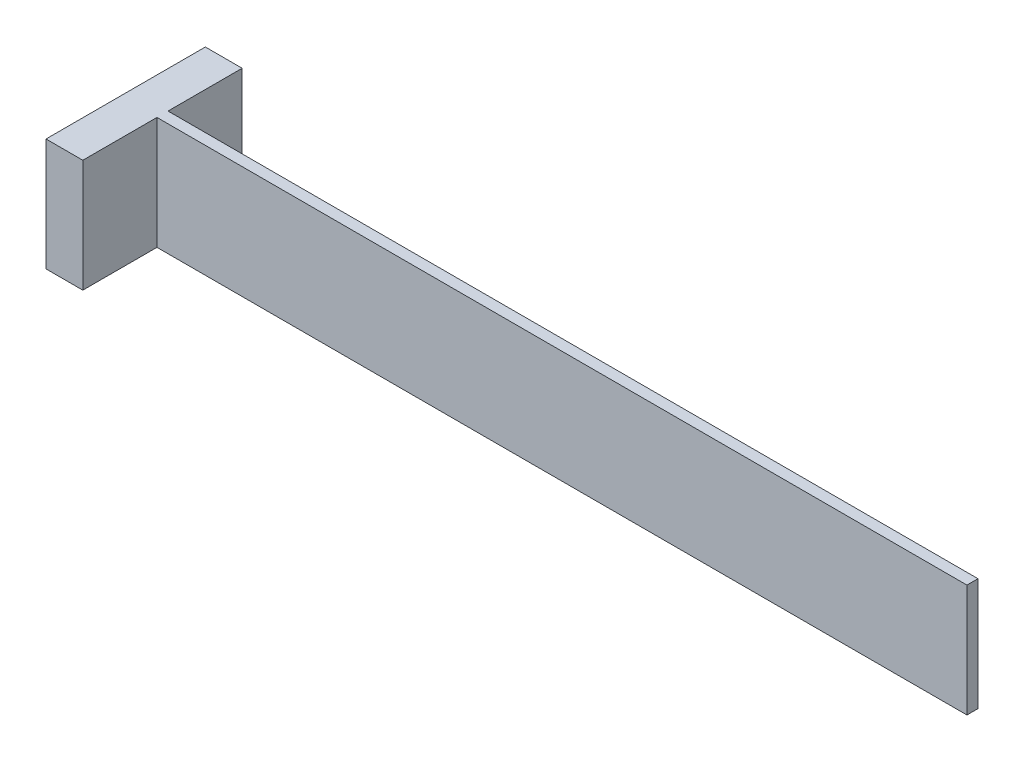
ISO-10303-21;
HEADER;
FILE_DESCRIPTION(('STEP AP214'),'2;1');
FILE_NAME('part.step','',(''),(''),'','','');
FILE_SCHEMA(('AUTOMOTIVE_DESIGN { 1 0 10303 214 1 1 1 1 }'));
ENDSEC;
DATA;
#1=APPLICATION_CONTEXT('core data for automotive mechanical design processes');
#2=APPLICATION_PROTOCOL_DEFINITION('international standard','automotive_design',2000,#1);
#3=PRODUCT_CONTEXT('',#1,'mechanical');
#4=PRODUCT('Part','Part','',(#3));
#5=PRODUCT_RELATED_PRODUCT_CATEGORY('part','',(#4));
#6=PRODUCT_DEFINITION_FORMATION('','',#4);
#7=PRODUCT_DEFINITION_CONTEXT('part definition',#1,'design');
#8=PRODUCT_DEFINITION('design','',#6,#7);
#9=PRODUCT_DEFINITION_SHAPE('','',#8);
#10=(LENGTH_UNIT() NAMED_UNIT(*) SI_UNIT(.MILLI.,.METRE.));
#11=(NAMED_UNIT(*) PLANE_ANGLE_UNIT() SI_UNIT($,.RADIAN.));
#12=(NAMED_UNIT(*) SI_UNIT($,.STERADIAN.) SOLID_ANGLE_UNIT());
#13=UNCERTAINTY_MEASURE_WITH_UNIT(LENGTH_MEASURE(1.E-05),#10,'distance_accuracy_value','');
#14=(GEOMETRIC_REPRESENTATION_CONTEXT(3) GLOBAL_UNCERTAINTY_ASSIGNED_CONTEXT((#13)) GLOBAL_UNIT_ASSIGNED_CONTEXT((#10,
#11,#12)) REPRESENTATION_CONTEXT('',''));
#15=CARTESIAN_POINT('',(0.,0.,0.));
#16=DIRECTION('',(0.,0.,1.));
#17=DIRECTION('',(1.,0.,0.));
#18=AXIS2_PLACEMENT_3D('',#15,#16,#17);
#19=CARTESIAN_POINT('',(10.,0.,0.));
#20=DIRECTION('',(-1.,0.,0.));
#21=DIRECTION('',(0.,0.,1.));
#22=AXIS2_PLACEMENT_3D('',#19,#20,#21);
#23=PLANE('',#22);
#24=DIRECTION('',(0.,-1.,0.));
#25=VECTOR('',#24,1.);
#26=CARTESIAN_POINT('',(10.,0.,46.0934230413332));
#27=LINE('',#26,#25);
#28=CARTESIAN_POINT('',(10.,9.44619477970314,46.0934230413332));
#29=VERTEX_POINT('',#28);
#30=CARTESIAN_POINT('',(10.,-21.1192908015721,46.0934230413332));
#31=VERTEX_POINT('',#30);
#32=EDGE_CURVE('E64',#29,#31,#27,.T.);
#33=ORIENTED_EDGE('',*,*,#32,.F.);
#34=DIRECTION('',(0.,0.,1.));
#35=VECTOR('',#34,1.);
#36=CARTESIAN_POINT('',(10.,9.44619477970314,0.));
#37=LINE('',#36,#35);
#38=CARTESIAN_POINT('',(10.,9.44619477970314,66.2327048687847));
#39=VERTEX_POINT('',#38);
#40=EDGE_CURVE('E126',#29,#39,#37,.T.);
#41=ORIENTED_EDGE('',*,*,#40,.T.);
#42=DIRECTION('',(0.,-1.,0.));
#43=VECTOR('',#42,1.);
#44=CARTESIAN_POINT('',(10.,0.,66.2327048687847));
#45=LINE('',#44,#43);
#46=CARTESIAN_POINT('',(10.,-21.1192908015721,66.2327048687847));
#47=VERTEX_POINT('',#46);
#48=EDGE_CURVE('E148',#39,#47,#45,.T.);
#49=ORIENTED_EDGE('',*,*,#48,.T.);
#50=DIRECTION('',(0.,0.,1.));
#51=VECTOR('',#50,1.);
#52=CARTESIAN_POINT('',(10.,-21.1192908015721,0.));
#53=LINE('',#52,#51);
#54=EDGE_CURVE('E141',#31,#47,#53,.T.);
#55=ORIENTED_EDGE('',*,*,#54,.F.);
#56=EDGE_LOOP('',(#33,#41,#49,#55));
#57=FACE_BOUND('',#56,.T.);
#58=ADVANCED_FACE('F37',(#57),#23,.F.);
#59=CARTESIAN_POINT('',(0.,6.84377816397593,26.1650943609405));
#60=DIRECTION('',(-1.,0.,0.));
#61=DIRECTION('',(0.,0.,1.));
#62=AXIS2_PLACEMENT_3D('',#59,#60,#61);
#63=PLANE('',#62);
#64=DIRECTION('',(0.,0.,-1.));
#65=VECTOR('',#64,1.);
#66=CARTESIAN_POINT('',(0.,9.44619477970314,22.9541412138816));
#67=LINE('',#66,#65);
#68=CARTESIAN_POINT('',(0.,9.44619477970314,66.2327048687847));
#69=VERTEX_POINT('',#68);
#70=CARTESIAN_POINT('',(0.,9.44619477970314,22.9541412138816));
#71=VERTEX_POINT('',#70);
#72=EDGE_CURVE('E129',#69,#71,#67,.T.);
#73=ORIENTED_EDGE('',*,*,#72,.T.);
#74=DIRECTION('',(0.,-1.,0.));
#75=VECTOR('',#74,1.);
#76=CARTESIAN_POINT('',(0.,9.44619477970314,22.9541412138816));
#77=LINE('',#76,#75);
#78=CARTESIAN_POINT('',(0.,-21.1192908015721,22.9541412138816));
#79=VERTEX_POINT('',#78);
#80=EDGE_CURVE('E147',#71,#79,#77,.T.);
#81=ORIENTED_EDGE('',*,*,#80,.T.);
#82=DIRECTION('',(0.,0.,1.));
#83=VECTOR('',#82,1.);
#84=CARTESIAN_POINT('',(0.,-21.1192908015721,22.9541412138816));
#85=LINE('',#84,#83);
#86=CARTESIAN_POINT('',(0.,-21.1192908015721,66.2327048687847));
#87=VERTEX_POINT('',#86);
#88=EDGE_CURVE('E153',#79,#87,#85,.T.);
#89=ORIENTED_EDGE('',*,*,#88,.T.);
#90=DIRECTION('',(0.,1.,0.));
#91=VECTOR('',#90,1.);
#92=CARTESIAN_POINT('',(0.,9.44619477970314,66.2327048687847));
#93=LINE('',#92,#91);
#94=EDGE_CURVE('E135',#87,#69,#93,.T.);
#95=ORIENTED_EDGE('',*,*,#94,.T.);
#96=EDGE_LOOP('',(#73,#81,#89,#95));
#97=FACE_BOUND('',#96,.T.);
#98=ADVANCED_FACE('F184',(#97),#63,.T.);
#99=CARTESIAN_POINT('',(-25.,9.44619477970314,22.9541412138816));
#100=DIRECTION('',(0.,-1.,0.));
#101=DIRECTION('',(0.,0.,-1.));
#102=AXIS2_PLACEMENT_3D('',#99,#100,#101);
#103=PLANE('',#102);
#104=ORIENTED_EDGE('',*,*,#72,.F.);
#105=DIRECTION('',(1.,0.,0.));
#106=VECTOR('',#105,1.);
#107=CARTESIAN_POINT('',(-25.,9.44619477970314,66.2327048687847));
#108=LINE('',#107,#106);
#109=EDGE_CURVE('E48',#69,#39,#108,.T.);
#110=ORIENTED_EDGE('',*,*,#109,.T.);
#111=ORIENTED_EDGE('',*,*,#40,.F.);
#112=DIRECTION('',(-1.,0.,0.));
#113=VECTOR('',#112,1.);
#114=CARTESIAN_POINT('',(230.,9.44619477970314,46.0934230413332));
#115=LINE('',#114,#113);
#116=CARTESIAN_POINT('',(230.,9.44619477970314,46.0934230413332));
#117=VERTEX_POINT('',#116);
#118=EDGE_CURVE('E108',#117,#29,#115,.T.);
#119=ORIENTED_EDGE('',*,*,#118,.F.);
#120=DIRECTION('',(0.,0.,1.));
#121=VECTOR('',#120,1.);
#122=CARTESIAN_POINT('',(230.,9.44619477970314,0.));
#123=LINE('',#122,#121);
#124=CARTESIAN_POINT('',(230.,9.44619477970314,43.0934230413332));
#125=VERTEX_POINT('',#124);
#126=EDGE_CURVE('E113',#125,#117,#123,.T.);
#127=ORIENTED_EDGE('',*,*,#126,.F.);
#128=DIRECTION('',(-1.,0.,0.));
#129=VECTOR('',#128,1.);
#130=CARTESIAN_POINT('',(230.,9.44619477970314,43.0934230413332));
#131=LINE('',#130,#129);
#132=CARTESIAN_POINT('',(10.,9.44619477970314,43.0934230413332));
#133=VERTEX_POINT('',#132);
#134=EDGE_CURVE('E172',#125,#133,#131,.T.);
#135=ORIENTED_EDGE('',*,*,#134,.T.);
#136=CARTESIAN_POINT('',(10.,9.44619477970314,22.9541412138816));
#137=VERTEX_POINT('',#136);
#138=EDGE_CURVE('E137',#137,#133,#37,.T.);
#139=ORIENTED_EDGE('',*,*,#138,.F.);
#140=DIRECTION('',(1.,0.,0.));
#141=VECTOR('',#140,1.);
#142=CARTESIAN_POINT('',(-25.,9.44619477970314,22.9541412138816));
#143=LINE('',#142,#141);
#144=EDGE_CURVE('E11',#71,#137,#143,.T.);
#145=ORIENTED_EDGE('',*,*,#144,.F.);
#146=EDGE_LOOP('',(#104,#110,#111,#119,#127,#135,#139,#145));
#147=FACE_BOUND('',#146,.T.);
#148=ADVANCED_FACE('F127',(#147),#103,.F.);
#149=ORIENTED_EDGE('',*,*,#138,.T.);
#150=DIRECTION('',(0.,-1.,0.));
#151=VECTOR('',#150,1.);
#152=CARTESIAN_POINT('',(10.,0.,43.0934230413332));
#153=LINE('',#152,#151);
#154=CARTESIAN_POINT('',(10.,-21.1192908015721,43.0934230413332));
#155=VERTEX_POINT('',#154);
#156=EDGE_CURVE('E54',#133,#155,#153,.T.);
#157=ORIENTED_EDGE('',*,*,#156,.T.);
#158=CARTESIAN_POINT('',(10.,-21.1192908015721,22.9541412138816));
#159=VERTEX_POINT('',#158);
#160=EDGE_CURVE('E145',#159,#155,#53,.T.);
#161=ORIENTED_EDGE('',*,*,#160,.F.);
#162=DIRECTION('',(0.,-1.,0.));
#163=VECTOR('',#162,1.);
#164=CARTESIAN_POINT('',(10.,0.,22.9541412138816));
#165=LINE('',#164,#163);
#166=EDGE_CURVE('E136',#137,#159,#165,.T.);
#167=ORIENTED_EDGE('',*,*,#166,.F.);
#168=EDGE_LOOP('',(#149,#157,#161,#167));
#169=FACE_BOUND('',#168,.T.);
#170=ADVANCED_FACE('F180',(#169),#23,.F.);
#171=CARTESIAN_POINT('',(-25.,9.44619477970314,66.2327048687847));
#172=DIRECTION('',(0.,0.,-1.));
#173=DIRECTION('',(-1.,0.,0.));
#174=AXIS2_PLACEMENT_3D('',#171,#172,#173);
#175=PLANE('',#174);
#176=ORIENTED_EDGE('',*,*,#94,.F.);
#177=DIRECTION('',(1.,0.,0.));
#178=VECTOR('',#177,1.);
#179=CARTESIAN_POINT('',(-25.,-21.1192908015721,66.2327048687847));
#180=LINE('',#179,#178);
#181=EDGE_CURVE('E157',#87,#47,#180,.T.);
#182=ORIENTED_EDGE('',*,*,#181,.T.);
#183=ORIENTED_EDGE('',*,*,#48,.F.);
#184=ORIENTED_EDGE('',*,*,#109,.F.);
#185=EDGE_LOOP('',(#176,#182,#183,#184));
#186=FACE_BOUND('',#185,.T.);
#187=ADVANCED_FACE('F45',(#186),#175,.F.);
#188=CARTESIAN_POINT('',(-25.,-21.1192908015721,22.9541412138816));
#189=DIRECTION('',(0.,1.,0.));
#190=DIRECTION('',(0.,0.,1.));
#191=AXIS2_PLACEMENT_3D('',#188,#189,#190);
#192=PLANE('',#191);
#193=ORIENTED_EDGE('',*,*,#88,.F.);
#194=DIRECTION('',(1.,0.,0.));
#195=VECTOR('',#194,1.);
#196=CARTESIAN_POINT('',(-25.,-21.1192908015721,22.9541412138816));
#197=LINE('',#196,#195);
#198=EDGE_CURVE('E149',#79,#159,#197,.T.);
#199=ORIENTED_EDGE('',*,*,#198,.T.);
#200=ORIENTED_EDGE('',*,*,#160,.T.);
#201=DIRECTION('',(-1.,0.,0.));
#202=VECTOR('',#201,1.);
#203=CARTESIAN_POINT('',(230.,-21.1192908015721,43.0934230413332));
#204=LINE('',#203,#202);
#205=CARTESIAN_POINT('',(230.,-21.1192908015721,43.0934230413332));
#206=VERTEX_POINT('',#205);
#207=EDGE_CURVE('E131',#206,#155,#204,.T.);
#208=ORIENTED_EDGE('',*,*,#207,.F.);
#209=DIRECTION('',(0.,0.,-1.));
#210=VECTOR('',#209,1.);
#211=CARTESIAN_POINT('',(230.,-21.1192908015721,0.));
#212=LINE('',#211,#210);
#213=CARTESIAN_POINT('',(230.,-21.1192908015721,46.0934230413332));
#214=VERTEX_POINT('',#213);
#215=EDGE_CURVE('E111',#214,#206,#212,.T.);
#216=ORIENTED_EDGE('',*,*,#215,.F.);
#217=DIRECTION('',(-1.,0.,0.));
#218=VECTOR('',#217,1.);
#219=CARTESIAN_POINT('',(230.,-21.1192908015721,46.0934230413332));
#220=LINE('',#219,#218);
#221=EDGE_CURVE('E112',#214,#31,#220,.T.);
#222=ORIENTED_EDGE('',*,*,#221,.T.);
#223=ORIENTED_EDGE('',*,*,#54,.T.);
#224=ORIENTED_EDGE('',*,*,#181,.F.);
#225=EDGE_LOOP('',(#193,#199,#200,#208,#216,#222,#223,#224));
#226=FACE_BOUND('',#225,.T.);
#227=ADVANCED_FACE('F170',(#226),#192,.F.);
#228=CARTESIAN_POINT('',(-25.,9.44619477970314,22.9541412138816));
#229=DIRECTION('',(0.,0.,1.));
#230=DIRECTION('',(1.,0.,0.));
#231=AXIS2_PLACEMENT_3D('',#228,#229,#230);
#232=PLANE('',#231);
#233=ORIENTED_EDGE('',*,*,#80,.F.);
#234=ORIENTED_EDGE('',*,*,#144,.T.);
#235=ORIENTED_EDGE('',*,*,#166,.T.);
#236=ORIENTED_EDGE('',*,*,#198,.F.);
#237=EDGE_LOOP('',(#233,#234,#235,#236));
#238=FACE_BOUND('',#237,.T.);
#239=ADVANCED_FACE('F185',(#238),#232,.F.);
#240=CARTESIAN_POINT('',(230.,0.,46.0934230413332));
#241=DIRECTION('',(0.,0.,-1.));
#242=DIRECTION('',(-1.,0.,0.));
#243=AXIS2_PLACEMENT_3D('',#240,#241,#242);
#244=PLANE('',#243);
#245=ORIENTED_EDGE('',*,*,#32,.T.);
#246=ORIENTED_EDGE('',*,*,#221,.F.);
#247=DIRECTION('',(0.,-1.,0.));
#248=VECTOR('',#247,1.);
#249=CARTESIAN_POINT('',(230.,0.,46.0934230413332));
#250=LINE('',#249,#248);
#251=EDGE_CURVE('E104',#117,#214,#250,.T.);
#252=ORIENTED_EDGE('',*,*,#251,.F.);
#253=ORIENTED_EDGE('',*,*,#118,.T.);
#254=EDGE_LOOP('',(#245,#246,#252,#253));
#255=FACE_BOUND('',#254,.T.);
#256=ADVANCED_FACE('F110',(#255),#244,.F.);
#257=CARTESIAN_POINT('',(230.,0.,43.0934230413332));
#258=DIRECTION('',(0.,0.,-1.));
#259=DIRECTION('',(-1.,0.,0.));
#260=AXIS2_PLACEMENT_3D('',#257,#258,#259);
#261=PLANE('',#260);
#262=ORIENTED_EDGE('',*,*,#156,.F.);
#263=ORIENTED_EDGE('',*,*,#134,.F.);
#264=DIRECTION('',(0.,-1.,0.));
#265=VECTOR('',#264,1.);
#266=CARTESIAN_POINT('',(230.,0.,43.0934230413332));
#267=LINE('',#266,#265);
#268=EDGE_CURVE('E121',#125,#206,#267,.T.);
#269=ORIENTED_EDGE('',*,*,#268,.T.);
#270=ORIENTED_EDGE('',*,*,#207,.T.);
#271=EDGE_LOOP('',(#262,#263,#269,#270));
#272=FACE_BOUND('',#271,.T.);
#273=ADVANCED_FACE('F176',(#272),#261,.T.);
#274=CARTESIAN_POINT('',(230.,0.,0.));
#275=DIRECTION('',(1.,0.,0.));
#276=DIRECTION('',(0.,0.,-1.));
#277=AXIS2_PLACEMENT_3D('',#274,#275,#276);
#278=PLANE('',#277);
#279=ORIENTED_EDGE('',*,*,#126,.T.);
#280=ORIENTED_EDGE('',*,*,#251,.T.);
#281=ORIENTED_EDGE('',*,*,#215,.T.);
#282=ORIENTED_EDGE('',*,*,#268,.F.);
#283=EDGE_LOOP('',(#279,#280,#281,#282));
#284=FACE_BOUND('',#283,.T.);
#285=ADVANCED_FACE('F116',(#284),#278,.T.);
#286=CLOSED_SHELL('',(#58,#98,#148,#170,#187,#227,#239,#256,#273,#285));
#287=MANIFOLD_SOLID_BREP('B2',#286);
#288=ADVANCED_BREP_SHAPE_REPRESENTATION('',(#18,#287),#14);
#289=SHAPE_DEFINITION_REPRESENTATION(#9,#288);
ENDSEC;
END-ISO-10303-21;
